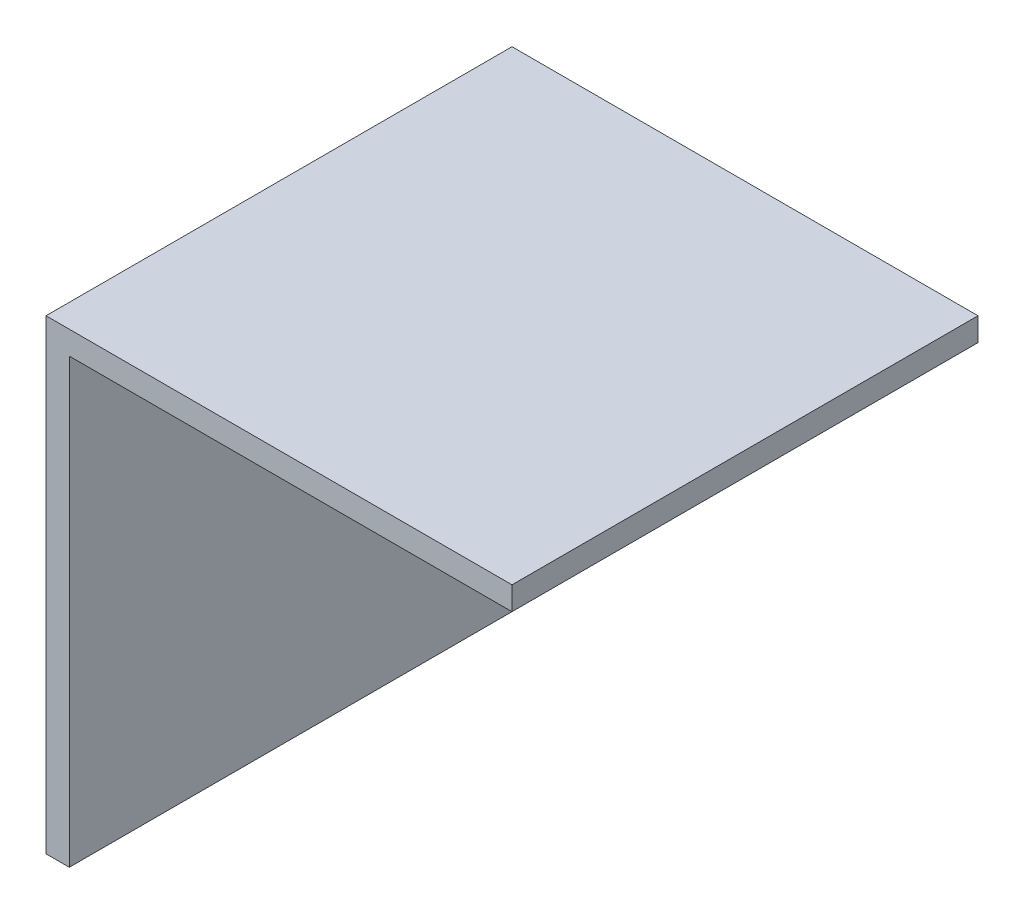
ISO-10303-21;
HEADER;
FILE_DESCRIPTION(('STEP AP214'),'2;1');
FILE_NAME('part.step','',(''),(''),'','','');
FILE_SCHEMA(('AUTOMOTIVE_DESIGN { 1 0 10303 214 1 1 1 1 }'));
ENDSEC;
DATA;
#1=APPLICATION_CONTEXT('core data for automotive mechanical design processes');
#2=APPLICATION_PROTOCOL_DEFINITION('international standard','automotive_design',2000,#1);
#3=PRODUCT_CONTEXT('',#1,'mechanical');
#4=PRODUCT('Part','Part','',(#3));
#5=PRODUCT_RELATED_PRODUCT_CATEGORY('part','',(#4));
#6=PRODUCT_DEFINITION_FORMATION('','',#4);
#7=PRODUCT_DEFINITION_CONTEXT('part definition',#1,'design');
#8=PRODUCT_DEFINITION('design','',#6,#7);
#9=PRODUCT_DEFINITION_SHAPE('','',#8);
#10=(LENGTH_UNIT() NAMED_UNIT(*) SI_UNIT(.MILLI.,.METRE.));
#11=(NAMED_UNIT(*) PLANE_ANGLE_UNIT() SI_UNIT($,.RADIAN.));
#12=(NAMED_UNIT(*) SI_UNIT($,.STERADIAN.) SOLID_ANGLE_UNIT());
#13=UNCERTAINTY_MEASURE_WITH_UNIT(LENGTH_MEASURE(1.E-05),#10,'distance_accuracy_value','');
#14=(GEOMETRIC_REPRESENTATION_CONTEXT(3) GLOBAL_UNCERTAINTY_ASSIGNED_CONTEXT((#13)) GLOBAL_UNIT_ASSIGNED_CONTEXT((#10,
#11,#12)) REPRESENTATION_CONTEXT('',''));
#15=CARTESIAN_POINT('',(0.,0.,0.));
#16=DIRECTION('',(0.,0.,1.));
#17=DIRECTION('',(1.,0.,0.));
#18=AXIS2_PLACEMENT_3D('',#15,#16,#17);
#19=CARTESIAN_POINT('',(0.,0.,50.8));
#20=DIRECTION('',(0.,1.,0.));
#21=DIRECTION('',(0.,0.,1.));
#22=AXIS2_PLACEMENT_3D('',#19,#20,#21);
#23=PLANE('',#22);
#24=DIRECTION('',(1.,0.,0.));
#25=VECTOR('',#24,1.);
#26=CARTESIAN_POINT('',(0.,0.,0.));
#27=LINE('',#26,#25);
#28=CARTESIAN_POINT('',(0.,0.,0.));
#29=VERTEX_POINT('',#28);
#30=CARTESIAN_POINT('',(2.54,0.,0.));
#31=VERTEX_POINT('',#30);
#32=EDGE_CURVE('E117',#29,#31,#27,.T.);
#33=ORIENTED_EDGE('',*,*,#32,.T.);
#34=DIRECTION('',(0.,0.,-1.));
#35=VECTOR('',#34,1.);
#36=CARTESIAN_POINT('',(2.54,0.,50.8));
#37=LINE('',#36,#35);
#38=CARTESIAN_POINT('',(2.54,0.,50.8));
#39=VERTEX_POINT('',#38);
#40=EDGE_CURVE('E11',#39,#31,#37,.T.);
#41=ORIENTED_EDGE('',*,*,#40,.F.);
#42=DIRECTION('',(1.,0.,0.));
#43=VECTOR('',#42,1.);
#44=CARTESIAN_POINT('',(0.,0.,50.8));
#45=LINE('',#44,#43);
#46=CARTESIAN_POINT('',(0.,0.,50.8));
#47=VERTEX_POINT('',#46);
#48=EDGE_CURVE('E127',#47,#39,#45,.T.);
#49=ORIENTED_EDGE('',*,*,#48,.F.);
#50=DIRECTION('',(0.,0.,-1.));
#51=VECTOR('',#50,1.);
#52=CARTESIAN_POINT('',(0.,0.,50.8));
#53=LINE('',#52,#51);
#54=EDGE_CURVE('E113',#47,#29,#53,.T.);
#55=ORIENTED_EDGE('',*,*,#54,.T.);
#56=EDGE_LOOP('',(#33,#41,#49,#55));
#57=FACE_BOUND('',#56,.T.);
#58=ADVANCED_FACE('F33',(#57),#23,.F.);
#59=CARTESIAN_POINT('',(2.54,0.,50.8));
#60=DIRECTION('',(-1.,0.,0.));
#61=DIRECTION('',(0.,0.,1.));
#62=AXIS2_PLACEMENT_3D('',#59,#60,#61);
#63=PLANE('',#62);
#64=DIRECTION('',(0.,1.,0.));
#65=VECTOR('',#64,1.);
#66=CARTESIAN_POINT('',(2.54,0.,0.));
#67=LINE('',#66,#65);
#68=CARTESIAN_POINT('',(2.54,48.26,0.));
#69=VERTEX_POINT('',#68);
#70=EDGE_CURVE('E120',#31,#69,#67,.T.);
#71=ORIENTED_EDGE('',*,*,#70,.T.);
#72=DIRECTION('',(0.,0.,-1.));
#73=VECTOR('',#72,1.);
#74=CARTESIAN_POINT('',(2.54,48.26,50.8));
#75=LINE('',#74,#73);
#76=CARTESIAN_POINT('',(2.54,48.26,50.8));
#77=VERTEX_POINT('',#76);
#78=EDGE_CURVE('E41',#77,#69,#75,.T.);
#79=ORIENTED_EDGE('',*,*,#78,.F.);
#80=DIRECTION('',(0.,1.,0.));
#81=VECTOR('',#80,1.);
#82=CARTESIAN_POINT('',(2.54,0.,50.8));
#83=LINE('',#82,#81);
#84=EDGE_CURVE('E86',#39,#77,#83,.T.);
#85=ORIENTED_EDGE('',*,*,#84,.F.);
#86=ORIENTED_EDGE('',*,*,#40,.T.);
#87=EDGE_LOOP('',(#71,#79,#85,#86));
#88=FACE_BOUND('',#87,.T.);
#89=ADVANCED_FACE('F151',(#88),#63,.F.);
#90=CARTESIAN_POINT('',(2.54,48.26,50.8));
#91=DIRECTION('',(0.,1.,0.));
#92=DIRECTION('',(0.,0.,1.));
#93=AXIS2_PLACEMENT_3D('',#90,#91,#92);
#94=PLANE('',#93);
#95=DIRECTION('',(1.,0.,0.));
#96=VECTOR('',#95,1.);
#97=CARTESIAN_POINT('',(2.54,48.26,0.));
#98=LINE('',#97,#96);
#99=CARTESIAN_POINT('',(50.8,48.26,0.));
#100=VERTEX_POINT('',#99);
#101=EDGE_CURVE('E122',#69,#100,#98,.T.);
#102=ORIENTED_EDGE('',*,*,#101,.T.);
#103=DIRECTION('',(0.,0.,-1.));
#104=VECTOR('',#103,1.);
#105=CARTESIAN_POINT('',(50.8,48.26,50.8));
#106=LINE('',#105,#104);
#107=CARTESIAN_POINT('',(50.8,48.26,50.8));
#108=VERTEX_POINT('',#107);
#109=EDGE_CURVE('E108',#108,#100,#106,.T.);
#110=ORIENTED_EDGE('',*,*,#109,.F.);
#111=DIRECTION('',(1.,0.,0.));
#112=VECTOR('',#111,1.);
#113=CARTESIAN_POINT('',(2.54,48.26,50.8));
#114=LINE('',#113,#112);
#115=EDGE_CURVE('E99',#77,#108,#114,.T.);
#116=ORIENTED_EDGE('',*,*,#115,.F.);
#117=ORIENTED_EDGE('',*,*,#78,.T.);
#118=EDGE_LOOP('',(#102,#110,#116,#117));
#119=FACE_BOUND('',#118,.T.);
#120=ADVANCED_FACE('F133',(#119),#94,.F.);
#121=CARTESIAN_POINT('',(50.8,48.26,50.8));
#122=DIRECTION('',(-1.,0.,0.));
#123=DIRECTION('',(0.,0.,1.));
#124=AXIS2_PLACEMENT_3D('',#121,#122,#123);
#125=PLANE('',#124);
#126=DIRECTION('',(0.,1.,0.));
#127=VECTOR('',#126,1.);
#128=CARTESIAN_POINT('',(50.8,48.26,0.));
#129=LINE('',#128,#127);
#130=CARTESIAN_POINT('',(50.8,50.8,0.));
#131=VERTEX_POINT('',#130);
#132=EDGE_CURVE('E107',#100,#131,#129,.T.);
#133=ORIENTED_EDGE('',*,*,#132,.T.);
#134=DIRECTION('',(0.,0.,-1.));
#135=VECTOR('',#134,1.);
#136=CARTESIAN_POINT('',(50.8,50.8,50.8));
#137=LINE('',#136,#135);
#138=CARTESIAN_POINT('',(50.8,50.8,50.8));
#139=VERTEX_POINT('',#138);
#140=EDGE_CURVE('E104',#139,#131,#137,.T.);
#141=ORIENTED_EDGE('',*,*,#140,.F.);
#142=DIRECTION('',(0.,1.,0.));
#143=VECTOR('',#142,1.);
#144=CARTESIAN_POINT('',(50.8,48.26,50.8));
#145=LINE('',#144,#143);
#146=EDGE_CURVE('E93',#108,#139,#145,.T.);
#147=ORIENTED_EDGE('',*,*,#146,.F.);
#148=ORIENTED_EDGE('',*,*,#109,.T.);
#149=EDGE_LOOP('',(#133,#141,#147,#148));
#150=FACE_BOUND('',#149,.T.);
#151=ADVANCED_FACE('F105',(#150),#125,.F.);
#152=CARTESIAN_POINT('',(0.,50.8,50.8));
#153=DIRECTION('',(0.,-1.,0.));
#154=DIRECTION('',(0.,0.,-1.));
#155=AXIS2_PLACEMENT_3D('',#152,#153,#154);
#156=PLANE('',#155);
#157=DIRECTION('',(-1.,0.,0.));
#158=VECTOR('',#157,1.);
#159=CARTESIAN_POINT('',(0.,50.8,0.));
#160=LINE('',#159,#158);
#161=CARTESIAN_POINT('',(0.,50.8,0.));
#162=VERTEX_POINT('',#161);
#163=EDGE_CURVE('E72',#131,#162,#160,.T.);
#164=ORIENTED_EDGE('',*,*,#163,.T.);
#165=DIRECTION('',(0.,0.,-1.));
#166=VECTOR('',#165,1.);
#167=CARTESIAN_POINT('',(0.,50.8,50.8));
#168=LINE('',#167,#166);
#169=CARTESIAN_POINT('',(0.,50.8,50.8));
#170=VERTEX_POINT('',#169);
#171=EDGE_CURVE('E109',#170,#162,#168,.T.);
#172=ORIENTED_EDGE('',*,*,#171,.F.);
#173=DIRECTION('',(-1.,0.,0.));
#174=VECTOR('',#173,1.);
#175=CARTESIAN_POINT('',(0.,50.8,50.8));
#176=LINE('',#175,#174);
#177=EDGE_CURVE('E97',#139,#170,#176,.T.);
#178=ORIENTED_EDGE('',*,*,#177,.F.);
#179=ORIENTED_EDGE('',*,*,#140,.T.);
#180=EDGE_LOOP('',(#164,#172,#178,#179));
#181=FACE_BOUND('',#180,.T.);
#182=ADVANCED_FACE('F111',(#181),#156,.F.);
#183=CARTESIAN_POINT('',(0.,0.,50.8));
#184=DIRECTION('',(1.,0.,0.));
#185=DIRECTION('',(0.,0.,-1.));
#186=AXIS2_PLACEMENT_3D('',#183,#184,#185);
#187=PLANE('',#186);
#188=DIRECTION('',(0.,-1.,0.));
#189=VECTOR('',#188,1.);
#190=CARTESIAN_POINT('',(0.,0.,0.));
#191=LINE('',#190,#189);
#192=EDGE_CURVE('E78',#162,#29,#191,.T.);
#193=ORIENTED_EDGE('',*,*,#192,.T.);
#194=ORIENTED_EDGE('',*,*,#54,.F.);
#195=DIRECTION('',(0.,-1.,0.));
#196=VECTOR('',#195,1.);
#197=CARTESIAN_POINT('',(0.,0.,50.8));
#198=LINE('',#197,#196);
#199=EDGE_CURVE('E49',#170,#47,#198,.T.);
#200=ORIENTED_EDGE('',*,*,#199,.F.);
#201=ORIENTED_EDGE('',*,*,#171,.T.);
#202=EDGE_LOOP('',(#193,#194,#200,#201));
#203=FACE_BOUND('',#202,.T.);
#204=ADVANCED_FACE('F140',(#203),#187,.F.);
#205=CARTESIAN_POINT('',(0.,0.,50.8));
#206=DIRECTION('',(0.,0.,1.));
#207=DIRECTION('',(1.,0.,0.));
#208=AXIS2_PLACEMENT_3D('',#205,#206,#207);
#209=PLANE('',#208);
#210=ORIENTED_EDGE('',*,*,#48,.T.);
#211=ORIENTED_EDGE('',*,*,#84,.T.);
#212=ORIENTED_EDGE('',*,*,#115,.T.);
#213=ORIENTED_EDGE('',*,*,#146,.T.);
#214=ORIENTED_EDGE('',*,*,#177,.T.);
#215=ORIENTED_EDGE('',*,*,#199,.T.);
#216=EDGE_LOOP('',(#210,#211,#212,#213,#214,#215));
#217=FACE_BOUND('',#216,.T.);
#218=ADVANCED_FACE('F95',(#217),#209,.T.);
#219=CARTESIAN_POINT('',(0.,0.,0.));
#220=DIRECTION('',(0.,0.,1.));
#221=DIRECTION('',(1.,0.,0.));
#222=AXIS2_PLACEMENT_3D('',#219,#220,#221);
#223=PLANE('',#222);
#224=ORIENTED_EDGE('',*,*,#32,.F.);
#225=ORIENTED_EDGE('',*,*,#192,.F.);
#226=ORIENTED_EDGE('',*,*,#163,.F.);
#227=ORIENTED_EDGE('',*,*,#132,.F.);
#228=ORIENTED_EDGE('',*,*,#101,.F.);
#229=ORIENTED_EDGE('',*,*,#70,.F.);
#230=EDGE_LOOP('',(#224,#225,#226,#227,#228,#229));
#231=FACE_BOUND('',#230,.T.);
#232=ADVANCED_FACE('F136',(#231),#223,.F.);
#233=CLOSED_SHELL('',(#58,#89,#120,#151,#182,#204,#218,#232));
#234=MANIFOLD_SOLID_BREP('B2',#233);
#235=ADVANCED_BREP_SHAPE_REPRESENTATION('',(#18,#234),#14);
#236=SHAPE_DEFINITION_REPRESENTATION(#9,#235);
ENDSEC;
END-ISO-10303-21;
